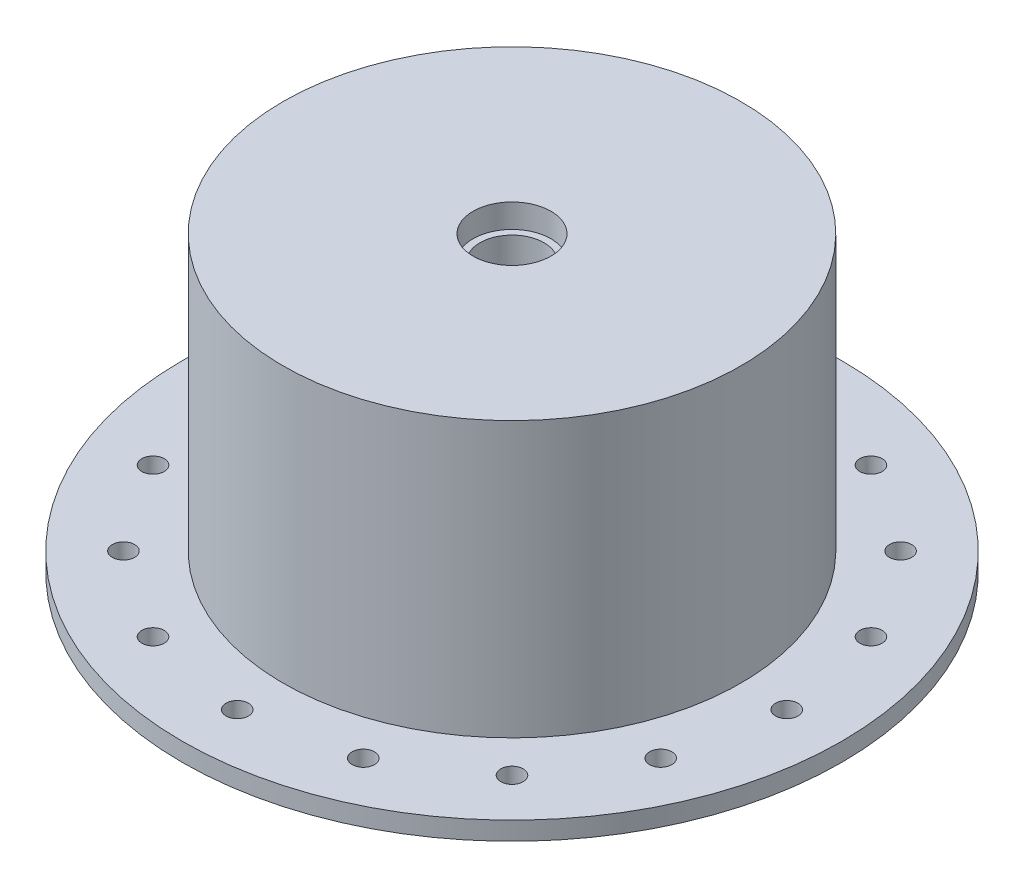
ISO-10303-21;
HEADER;
FILE_DESCRIPTION(('STEP AP214'),'2;1');
FILE_NAME('part.step','',(''),(''),'','','');
FILE_SCHEMA(('AUTOMOTIVE_DESIGN { 1 0 10303 214 1 1 1 1 }'));
ENDSEC;
DATA;
#1=APPLICATION_CONTEXT('core data for automotive mechanical design processes');
#2=APPLICATION_PROTOCOL_DEFINITION('international standard','automotive_design',2000,#1);
#3=PRODUCT_CONTEXT('',#1,'mechanical');
#4=PRODUCT('Part','Part','',(#3));
#5=PRODUCT_RELATED_PRODUCT_CATEGORY('part','',(#4));
#6=PRODUCT_DEFINITION_FORMATION('','',#4);
#7=PRODUCT_DEFINITION_CONTEXT('part definition',#1,'design');
#8=PRODUCT_DEFINITION('design','',#6,#7);
#9=PRODUCT_DEFINITION_SHAPE('','',#8);
#10=(LENGTH_UNIT() NAMED_UNIT(*) SI_UNIT(.MILLI.,.METRE.));
#11=(NAMED_UNIT(*) PLANE_ANGLE_UNIT() SI_UNIT($,.RADIAN.));
#12=(NAMED_UNIT(*) SI_UNIT($,.STERADIAN.) SOLID_ANGLE_UNIT());
#13=UNCERTAINTY_MEASURE_WITH_UNIT(LENGTH_MEASURE(1.E-05),#10,'distance_accuracy_value','');
#14=(GEOMETRIC_REPRESENTATION_CONTEXT(3) GLOBAL_UNCERTAINTY_ASSIGNED_CONTEXT((#13)) GLOBAL_UNIT_ASSIGNED_CONTEXT((#10,
#11,#12)) REPRESENTATION_CONTEXT('',''));
#15=CARTESIAN_POINT('',(0.,0.,0.));
#16=DIRECTION('',(0.,0.,1.));
#17=DIRECTION('',(1.,0.,0.));
#18=AXIS2_PLACEMENT_3D('',#15,#16,#17);
#19=CARTESIAN_POINT('',(0.,80.,0.));
#20=DIRECTION('',(0.,1.,0.));
#21=DIRECTION('',(-1.,0.,0.));
#22=AXIS2_PLACEMENT_3D('',#19,#20,#21);
#23=CYLINDRICAL_SURFACE('',#22,21.25);
#24=CARTESIAN_POINT('',(0.,67.,0.));
#25=DIRECTION('',(0.,1.,0.));
#26=DIRECTION('',(-1.,0.,0.));
#27=AXIS2_PLACEMENT_3D('',#24,#25,#26);
#28=CIRCLE('',#27,21.25);
#29=CARTESIAN_POINT('',(-21.25,67.,0.));
#30=VERTEX_POINT('',#29);
#31=EDGE_CURVE('E66',#30,#30,#28,.T.);
#32=ORIENTED_EDGE('',*,*,#31,.F.);
#33=EDGE_LOOP('',(#32));
#34=FACE_BOUND('',#33,.T.);
#35=CARTESIAN_POINT('',(0.,80.,0.));
#36=DIRECTION('',(0.,1.,0.));
#37=DIRECTION('',(-1.,0.,0.));
#38=AXIS2_PLACEMENT_3D('',#35,#36,#37);
#39=CIRCLE('',#38,21.25);
#40=CARTESIAN_POINT('',(-21.25,80.,0.));
#41=VERTEX_POINT('',#40);
#42=EDGE_CURVE('E10',#41,#41,#39,.T.);
#43=ORIENTED_EDGE('',*,*,#42,.T.);
#44=EDGE_LOOP('',(#43));
#45=FACE_BOUND('',#44,.T.);
#46=ADVANCED_FACE('F32',(#34,#45),#23,.F.);
#47=CARTESIAN_POINT('',(0.,80.,0.));
#48=DIRECTION('',(0.,1.,0.));
#49=DIRECTION('',(-1.,0.,0.));
#50=AXIS2_PLACEMENT_3D('',#47,#48,#49);
#51=PLANE('',#50);
#52=CARTESIAN_POINT('',(0.,80.,0.));
#53=DIRECTION('',(0.,1.,0.));
#54=DIRECTION('',(-1.,0.,0.));
#55=AXIS2_PLACEMENT_3D('',#52,#53,#54);
#56=CIRCLE('',#55,125.);
#57=CARTESIAN_POINT('',(-125.,80.,0.));
#58=VERTEX_POINT('',#57);
#59=EDGE_CURVE('E38',#58,#58,#56,.T.);
#60=ORIENTED_EDGE('',*,*,#59,.T.);
#61=EDGE_LOOP('',(#60));
#62=FACE_BOUND('',#61,.T.);
#63=ORIENTED_EDGE('',*,*,#42,.F.);
#64=EDGE_LOOP('',(#63));
#65=FACE_BOUND('',#64,.T.);
#66=ADVANCED_FACE('F186',(#62,#65),#51,.T.);
#67=CARTESIAN_POINT('',(0.,80.,0.));
#68=DIRECTION('',(0.,1.,0.));
#69=DIRECTION('',(-1.,0.,0.));
#70=AXIS2_PLACEMENT_3D('',#67,#68,#69);
#71=CYLINDRICAL_SURFACE('',#70,125.);
#72=ORIENTED_EDGE('',*,*,#59,.F.);
#73=EDGE_LOOP('',(#72));
#74=FACE_BOUND('',#73,.T.);
#75=CARTESIAN_POINT('',(0.,-70.,0.));
#76=DIRECTION('',(0.,1.,0.));
#77=DIRECTION('',(-1.,0.,0.));
#78=AXIS2_PLACEMENT_3D('',#75,#76,#77);
#79=CIRCLE('',#78,125.);
#80=CARTESIAN_POINT('',(-125.,-70.0000000000001,0.));
#81=VERTEX_POINT('',#80);
#82=EDGE_CURVE('E42',#81,#81,#79,.T.);
#83=ORIENTED_EDGE('',*,*,#82,.T.);
#84=EDGE_LOOP('',(#83));
#85=FACE_BOUND('',#84,.T.);
#86=ADVANCED_FACE('F191',(#74,#85),#71,.T.);
#87=CARTESIAN_POINT('',(0.,-70.,0.));
#88=DIRECTION('',(0.,1.,0.));
#89=DIRECTION('',(-1.,0.,0.));
#90=AXIS2_PLACEMENT_3D('',#87,#88,#89);
#91=PLANE('',#90);
#92=CARTESIAN_POINT('',(-57.402514854763,-70.,-138.581929876691));
#93=DIRECTION('',(0.,1.,0.));
#94=DIRECTION('',(-1.,0.,0.));
#95=AXIS2_PLACEMENT_3D('',#92,#93,#94);
#96=CIRCLE('',#95,6.10000000000463);
#97=CARTESIAN_POINT('',(-63.5025148547677,-70.,-138.581929876691));
#98=VERTEX_POINT('',#97);
#99=EDGE_CURVE('E69',#98,#98,#96,.T.);
#100=ORIENTED_EDGE('',*,*,#99,.F.);
#101=EDGE_LOOP('',(#100));
#102=FACE_BOUND('',#101,.T.);
#103=CARTESIAN_POINT('',(-106.06601717798,-70.,-106.066017177978));
#104=DIRECTION('',(0.,1.,0.));
#105=DIRECTION('',(-1.,0.,0.));
#106=AXIS2_PLACEMENT_3D('',#103,#104,#105);
#107=CIRCLE('',#106,6.10000000000621);
#108=CARTESIAN_POINT('',(-112.166017177986,-70.,-106.066017177978));
#109=VERTEX_POINT('',#108);
#110=EDGE_CURVE('E72',#109,#109,#107,.T.);
#111=ORIENTED_EDGE('',*,*,#110,.F.);
#112=EDGE_LOOP('',(#111));
#113=FACE_BOUND('',#112,.T.);
#114=CARTESIAN_POINT('',(-138.581929876689,-70.,-57.4025148547576));
#115=DIRECTION('',(0.,1.,0.));
#116=DIRECTION('',(-1.,0.,0.));
#117=AXIS2_PLACEMENT_3D('',#114,#115,#116);
#118=CIRCLE('',#117,6.1000000000083);
#119=CARTESIAN_POINT('',(-144.681929876697,-70.,-57.4025148547576));
#120=VERTEX_POINT('',#119);
#121=EDGE_CURVE('E75',#120,#120,#118,.T.);
#122=ORIENTED_EDGE('',*,*,#121,.F.);
#123=EDGE_LOOP('',(#122));
#124=FACE_BOUND('',#123,.T.);
#125=CARTESIAN_POINT('',(-149.999999999994,-70.,6.3856997708473E-12));
#126=DIRECTION('',(0.,1.,0.));
#127=DIRECTION('',(-1.,0.,0.));
#128=AXIS2_PLACEMENT_3D('',#125,#126,#127);
#129=CIRCLE('',#128,6.10000000001255);
#130=CARTESIAN_POINT('',(-156.100000000006,-70.,6.3856997708473E-12));
#131=VERTEX_POINT('',#130);
#132=EDGE_CURVE('E78',#131,#131,#129,.T.);
#133=ORIENTED_EDGE('',*,*,#132,.F.);
#134=EDGE_LOOP('',(#133));
#135=FACE_BOUND('',#134,.T.);
#136=CARTESIAN_POINT('',(-138.581929876684,-70.,57.4025148547694));
#137=DIRECTION('',(0.,1.,0.));
#138=DIRECTION('',(-1.,0.,0.));
#139=AXIS2_PLACEMENT_3D('',#136,#137,#138);
#140=CIRCLE('',#139,6.10000000001461);
#141=CARTESIAN_POINT('',(-144.681929876699,-70.,57.4025148547694));
#142=VERTEX_POINT('',#141);
#143=EDGE_CURVE('E81',#142,#142,#140,.T.);
#144=ORIENTED_EDGE('',*,*,#143,.F.);
#145=EDGE_LOOP('',(#144));
#146=FACE_BOUND('',#145,.T.);
#147=CARTESIAN_POINT('',(-106.066017177971,-70.,106.066017177987));
#148=DIRECTION('',(0.,1.,0.));
#149=DIRECTION('',(-1.,0.,0.));
#150=AXIS2_PLACEMENT_3D('',#147,#148,#149);
#151=CIRCLE('',#150,6.10000000001588);
#152=CARTESIAN_POINT('',(-112.166017177987,-70.,106.066017177987));
#153=VERTEX_POINT('',#152);
#154=EDGE_CURVE('E84',#153,#153,#151,.T.);
#155=ORIENTED_EDGE('',*,*,#154,.F.);
#156=EDGE_LOOP('',(#155));
#157=FACE_BOUND('',#156,.T.);
#158=CARTESIAN_POINT('',(-57.4025148547512,-70.,138.581929876695));
#159=DIRECTION('',(0.,1.,0.));
#160=DIRECTION('',(-1.,0.,0.));
#161=AXIS2_PLACEMENT_3D('',#158,#159,#160);
#162=CIRCLE('',#161,6.10000000001635);
#163=CARTESIAN_POINT('',(-63.5025148547675,-70.,138.581929876695));
#164=VERTEX_POINT('',#163);
#165=EDGE_CURVE('E87',#164,#164,#162,.T.);
#166=ORIENTED_EDGE('',*,*,#165,.F.);
#167=EDGE_LOOP('',(#166));
#168=FACE_BOUND('',#167,.T.);
#169=CARTESIAN_POINT('',(1.27560914567053E-11,-70.,150.));
#170=DIRECTION('',(0.,1.,0.));
#171=DIRECTION('',(-1.,0.,0.));
#172=AXIS2_PLACEMENT_3D('',#169,#170,#171);
#173=CIRCLE('',#172,6.10000000001599);
#174=CARTESIAN_POINT('',(-6.10000000000323,-70.,150.));
#175=VERTEX_POINT('',#174);
#176=EDGE_CURVE('E90',#175,#175,#173,.T.);
#177=ORIENTED_EDGE('',*,*,#176,.F.);
#178=EDGE_LOOP('',(#177));
#179=FACE_BOUND('',#178,.T.);
#180=CARTESIAN_POINT('',(57.4025148547757,-70.,138.581929876691));
#181=DIRECTION('',(0.,1.,0.));
#182=DIRECTION('',(-1.,0.,0.));
#183=AXIS2_PLACEMENT_3D('',#180,#181,#182);
#184=CIRCLE('',#183,6.10000000001459);
#185=CARTESIAN_POINT('',(51.3025148547611,-70.,138.581929876691));
#186=VERTEX_POINT('',#185);
#187=EDGE_CURVE('E93',#186,#186,#184,.T.);
#188=ORIENTED_EDGE('',*,*,#187,.F.);
#189=EDGE_LOOP('',(#188));
#190=FACE_BOUND('',#189,.T.);
#191=CARTESIAN_POINT('',(106.066017177993,-70.,106.066017177978));
#192=DIRECTION('',(0.,1.,0.));
#193=DIRECTION('',(-1.,0.,0.));
#194=AXIS2_PLACEMENT_3D('',#191,#192,#193);
#195=CIRCLE('',#194,6.10000000001236);
#196=CARTESIAN_POINT('',(99.9660171779806,-70.,106.066017177978));
#197=VERTEX_POINT('',#196);
#198=EDGE_CURVE('E96',#197,#197,#195,.T.);
#199=ORIENTED_EDGE('',*,*,#198,.F.);
#200=EDGE_LOOP('',(#199));
#201=FACE_BOUND('',#200,.T.);
#202=CARTESIAN_POINT('',(138.581929876702,-70.,57.4025148547576));
#203=DIRECTION('',(0.,1.,0.));
#204=DIRECTION('',(-1.,0.,0.));
#205=AXIS2_PLACEMENT_3D('',#202,#203,#204);
#206=CIRCLE('',#205,6.10000000000972);
#207=CARTESIAN_POINT('',(132.481929876692,-70.,57.4025148547576));
#208=VERTEX_POINT('',#207);
#209=EDGE_CURVE('E99',#208,#208,#206,.T.);
#210=ORIENTED_EDGE('',*,*,#209,.F.);
#211=EDGE_LOOP('',(#210));
#212=FACE_BOUND('',#211,.T.);
#213=CARTESIAN_POINT('',(150.000000000006,-70.,-6.36733006886009E-12));
#214=DIRECTION('',(0.,1.,0.));
#215=DIRECTION('',(-1.,0.,0.));
#216=AXIS2_PLACEMENT_3D('',#213,#214,#215);
#217=CIRCLE('',#216,6.10000000000717);
#218=CARTESIAN_POINT('',(143.899999999999,-70.,-6.36733006886009E-12));
#219=VERTEX_POINT('',#218);
#220=EDGE_CURVE('E102',#219,#219,#217,.T.);
#221=ORIENTED_EDGE('',*,*,#220,.F.);
#222=EDGE_LOOP('',(#221));
#223=FACE_BOUND('',#222,.T.);
#224=CARTESIAN_POINT('',(138.581929876697,-70.,-57.4025148547694));
#225=DIRECTION('',(0.,1.,0.));
#226=DIRECTION('',(-1.,0.,0.));
#227=AXIS2_PLACEMENT_3D('',#224,#225,#226);
#228=CIRCLE('',#227,6.10000000000469);
#229=CARTESIAN_POINT('',(132.481929876692,-70.,-57.4025148547694));
#230=VERTEX_POINT('',#229);
#231=EDGE_CURVE('E105',#230,#230,#228,.T.);
#232=ORIENTED_EDGE('',*,*,#231,.F.);
#233=EDGE_LOOP('',(#232));
#234=FACE_BOUND('',#233,.T.);
#235=CARTESIAN_POINT('',(106.066017177984,-70.,-106.066017177987));
#236=DIRECTION('',(0.,1.,0.));
#237=DIRECTION('',(-1.,0.,0.));
#238=AXIS2_PLACEMENT_3D('',#235,#236,#237);
#239=CIRCLE('',#238,6.10000000000195);
#240=CARTESIAN_POINT('',(99.9660171779821,-70.,-106.066017177987));
#241=VERTEX_POINT('',#240);
#242=EDGE_CURVE('E108',#241,#241,#239,.T.);
#243=ORIENTED_EDGE('',*,*,#242,.F.);
#244=EDGE_LOOP('',(#243));
#245=FACE_BOUND('',#244,.T.);
#246=CARTESIAN_POINT('',(57.4025148547653,-70.,-138.581929876692));
#247=DIRECTION('',(0.,1.,0.));
#248=DIRECTION('',(-1.,0.,0.));
#249=AXIS2_PLACEMENT_3D('',#246,#247,#248);
#250=CIRCLE('',#249,6.09999999999999);
#251=CARTESIAN_POINT('',(51.3025148547653,-70.,-138.581929876692));
#252=VERTEX_POINT('',#251);
#253=EDGE_CURVE('E111',#252,#252,#250,.T.);
#254=ORIENTED_EDGE('',*,*,#253,.F.);
#255=EDGE_LOOP('',(#254));
#256=FACE_BOUND('',#255,.T.);
#257=CARTESIAN_POINT('',(0.,-70.,-150.));
#258=DIRECTION('',(0.,1.,0.));
#259=DIRECTION('',(-1.,0.,0.));
#260=AXIS2_PLACEMENT_3D('',#257,#258,#259);
#261=CIRCLE('',#260,6.09999999999999);
#262=CARTESIAN_POINT('',(-6.09999999999997,-70.,-150.));
#263=VERTEX_POINT('',#262);
#264=EDGE_CURVE('E114',#263,#263,#261,.T.);
#265=ORIENTED_EDGE('',*,*,#264,.F.);
#266=EDGE_LOOP('',(#265));
#267=FACE_BOUND('',#266,.T.);
#268=CARTESIAN_POINT('',(0.,-70.,0.));
#269=DIRECTION('',(0.,1.,0.));
#270=DIRECTION('',(-1.,0.,0.));
#271=AXIS2_PLACEMENT_3D('',#268,#269,#270);
#272=CIRCLE('',#271,180.);
#273=CARTESIAN_POINT('',(-180.,-70.,0.));
#274=VERTEX_POINT('',#273);
#275=EDGE_CURVE('E46',#274,#274,#272,.T.);
#276=ORIENTED_EDGE('',*,*,#275,.T.);
#277=EDGE_LOOP('',(#276));
#278=FACE_BOUND('',#277,.T.);
#279=ORIENTED_EDGE('',*,*,#82,.F.);
#280=EDGE_LOOP('',(#279));
#281=FACE_BOUND('',#280,.T.);
#282=ADVANCED_FACE('F220',(#102,#113,#124,#135,#146,#157,#168,#179,#190,#201,#212,#223,#234,
#245,#256,#267,#278,#281),#91,.T.);
#283=CARTESIAN_POINT('',(0.,80.,0.));
#284=DIRECTION('',(0.,1.,0.));
#285=DIRECTION('',(-1.,0.,0.));
#286=AXIS2_PLACEMENT_3D('',#283,#284,#285);
#287=CYLINDRICAL_SURFACE('',#286,180.);
#288=CARTESIAN_POINT('',(0.,-80.,0.));
#289=DIRECTION('',(0.,1.,0.));
#290=DIRECTION('',(-1.,0.,0.));
#291=AXIS2_PLACEMENT_3D('',#288,#289,#290);
#292=CIRCLE('',#291,180.);
#293=CARTESIAN_POINT('',(-180.,-80.,0.));
#294=VERTEX_POINT('',#293);
#295=EDGE_CURVE('E51',#294,#294,#292,.T.);
#296=ORIENTED_EDGE('',*,*,#295,.T.);
#297=EDGE_LOOP('',(#296));
#298=FACE_BOUND('',#297,.T.);
#299=ORIENTED_EDGE('',*,*,#275,.F.);
#300=EDGE_LOOP('',(#299));
#301=FACE_BOUND('',#300,.T.);
#302=ADVANCED_FACE('F216',(#298,#301),#287,.T.);
#303=CARTESIAN_POINT('',(0.,-80.,0.));
#304=DIRECTION('',(0.,-1.,0.));
#305=DIRECTION('',(1.,0.,0.));
#306=AXIS2_PLACEMENT_3D('',#303,#304,#305);
#307=PLANE('',#306);
#308=CARTESIAN_POINT('',(-57.402514854763,-80.,-138.581929876691));
#309=DIRECTION('',(0.,1.,0.));
#310=DIRECTION('',(0.,0.,1.));
#311=AXIS2_PLACEMENT_3D('',#308,#309,#310);
#312=CIRCLE('',#311,6.10000000000463);
#313=CARTESIAN_POINT('',(-57.402514854763,-80.,-132.481929876686));
#314=VERTEX_POINT('',#313);
#315=EDGE_CURVE('E121',#314,#314,#312,.T.);
#316=ORIENTED_EDGE('',*,*,#315,.T.);
#317=EDGE_LOOP('',(#316));
#318=FACE_BOUND('',#317,.T.);
#319=CARTESIAN_POINT('',(-106.06601717798,-80.,-106.066017177978));
#320=DIRECTION('',(0.,1.,0.));
#321=DIRECTION('',(0.,0.,1.));
#322=AXIS2_PLACEMENT_3D('',#319,#320,#321);
#323=CIRCLE('',#322,6.10000000000621);
#324=CARTESIAN_POINT('',(-106.06601717798,-80.,-99.9660171779714));
#325=VERTEX_POINT('',#324);
#326=EDGE_CURVE('E124',#325,#325,#323,.T.);
#327=ORIENTED_EDGE('',*,*,#326,.T.);
#328=EDGE_LOOP('',(#327));
#329=FACE_BOUND('',#328,.T.);
#330=CARTESIAN_POINT('',(-138.581929876689,-80.,-57.4025148547576));
#331=DIRECTION('',(0.,1.,0.));
#332=DIRECTION('',(0.,0.,1.));
#333=AXIS2_PLACEMENT_3D('',#330,#331,#332);
#334=CIRCLE('',#333,6.1000000000083);
#335=CARTESIAN_POINT('',(-138.581929876689,-80.,-51.3025148547493));
#336=VERTEX_POINT('',#335);
#337=EDGE_CURVE('E127',#336,#336,#334,.T.);
#338=ORIENTED_EDGE('',*,*,#337,.T.);
#339=EDGE_LOOP('',(#338));
#340=FACE_BOUND('',#339,.T.);
#341=CARTESIAN_POINT('',(-149.999999999994,-80.,6.3856997708473E-12));
#342=DIRECTION('',(0.,1.,0.));
#343=DIRECTION('',(0.,0.,1.));
#344=AXIS2_PLACEMENT_3D('',#341,#342,#343);
#345=CIRCLE('',#344,6.10000000001255);
#346=CARTESIAN_POINT('',(-149.999999999994,-80.,6.10000000001893));
#347=VERTEX_POINT('',#346);
#348=EDGE_CURVE('E130',#347,#347,#345,.T.);
#349=ORIENTED_EDGE('',*,*,#348,.T.);
#350=EDGE_LOOP('',(#349));
#351=FACE_BOUND('',#350,.T.);
#352=CARTESIAN_POINT('',(-138.581929876684,-80.,57.4025148547694));
#353=DIRECTION('',(0.,1.,0.));
#354=DIRECTION('',(0.,0.,1.));
#355=AXIS2_PLACEMENT_3D('',#352,#353,#354);
#356=CIRCLE('',#355,6.10000000001461);
#357=CARTESIAN_POINT('',(-138.581929876684,-80.,63.502514854784));
#358=VERTEX_POINT('',#357);
#359=EDGE_CURVE('E133',#358,#358,#356,.T.);
#360=ORIENTED_EDGE('',*,*,#359,.T.);
#361=EDGE_LOOP('',(#360));
#362=FACE_BOUND('',#361,.T.);
#363=CARTESIAN_POINT('',(-106.066017177971,-80.,106.066017177987));
#364=DIRECTION('',(0.,1.,0.));
#365=DIRECTION('',(0.,0.,1.));
#366=AXIS2_PLACEMENT_3D('',#363,#364,#365);
#367=CIRCLE('',#366,6.10000000001588);
#368=CARTESIAN_POINT('',(-106.066017177971,-80.,112.166017178003));
#369=VERTEX_POINT('',#368);
#370=EDGE_CURVE('E136',#369,#369,#367,.T.);
#371=ORIENTED_EDGE('',*,*,#370,.T.);
#372=EDGE_LOOP('',(#371));
#373=FACE_BOUND('',#372,.T.);
#374=CARTESIAN_POINT('',(-57.4025148547512,-80.,138.581929876695));
#375=DIRECTION('',(0.,1.,0.));
#376=DIRECTION('',(0.,0.,1.));
#377=AXIS2_PLACEMENT_3D('',#374,#375,#376);
#378=CIRCLE('',#377,6.10000000001635);
#379=CARTESIAN_POINT('',(-57.4025148547512,-80.,144.681929876712));
#380=VERTEX_POINT('',#379);
#381=EDGE_CURVE('E139',#380,#380,#378,.T.);
#382=ORIENTED_EDGE('',*,*,#381,.T.);
#383=EDGE_LOOP('',(#382));
#384=FACE_BOUND('',#383,.T.);
#385=CARTESIAN_POINT('',(1.27560914567053E-11,-80.,150.));
#386=DIRECTION('',(0.,1.,0.));
#387=DIRECTION('',(0.,0.,1.));
#388=AXIS2_PLACEMENT_3D('',#385,#386,#387);
#389=CIRCLE('',#388,6.10000000001599);
#390=CARTESIAN_POINT('',(1.27560914567053E-11,-80.,156.100000000016));
#391=VERTEX_POINT('',#390);
#392=EDGE_CURVE('E142',#391,#391,#389,.T.);
#393=ORIENTED_EDGE('',*,*,#392,.T.);
#394=EDGE_LOOP('',(#393));
#395=FACE_BOUND('',#394,.T.);
#396=CARTESIAN_POINT('',(57.4025148547757,-80.,138.581929876691));
#397=DIRECTION('',(0.,1.,0.));
#398=DIRECTION('',(0.,0.,1.));
#399=AXIS2_PLACEMENT_3D('',#396,#397,#398);
#400=CIRCLE('',#399,6.10000000001459);
#401=CARTESIAN_POINT('',(57.4025148547757,-80.,144.681929876705));
#402=VERTEX_POINT('',#401);
#403=EDGE_CURVE('E145',#402,#402,#400,.T.);
#404=ORIENTED_EDGE('',*,*,#403,.T.);
#405=EDGE_LOOP('',(#404));
#406=FACE_BOUND('',#405,.T.);
#407=CARTESIAN_POINT('',(106.066017177993,-80.,106.066017177978));
#408=DIRECTION('',(0.,1.,0.));
#409=DIRECTION('',(0.,0.,1.));
#410=AXIS2_PLACEMENT_3D('',#407,#408,#409);
#411=CIRCLE('',#410,6.10000000001236);
#412=CARTESIAN_POINT('',(106.066017177993,-80.,112.16601717799));
#413=VERTEX_POINT('',#412);
#414=EDGE_CURVE('E148',#413,#413,#411,.T.);
#415=ORIENTED_EDGE('',*,*,#414,.T.);
#416=EDGE_LOOP('',(#415));
#417=FACE_BOUND('',#416,.T.);
#418=CARTESIAN_POINT('',(138.581929876702,-80.,57.4025148547576));
#419=DIRECTION('',(0.,1.,0.));
#420=DIRECTION('',(0.,0.,1.));
#421=AXIS2_PLACEMENT_3D('',#418,#419,#420);
#422=CIRCLE('',#421,6.10000000000972);
#423=CARTESIAN_POINT('',(138.581929876702,-80.,63.5025148547673));
#424=VERTEX_POINT('',#423);
#425=EDGE_CURVE('E151',#424,#424,#422,.T.);
#426=ORIENTED_EDGE('',*,*,#425,.T.);
#427=EDGE_LOOP('',(#426));
#428=FACE_BOUND('',#427,.T.);
#429=CARTESIAN_POINT('',(150.000000000006,-80.,-6.36733006886009E-12));
#430=DIRECTION('',(0.,1.,0.));
#431=DIRECTION('',(0.,0.,1.));
#432=AXIS2_PLACEMENT_3D('',#429,#430,#431);
#433=CIRCLE('',#432,6.10000000000717);
#434=CARTESIAN_POINT('',(150.000000000006,-80.,6.1000000000008));
#435=VERTEX_POINT('',#434);
#436=EDGE_CURVE('E154',#435,#435,#433,.T.);
#437=ORIENTED_EDGE('',*,*,#436,.T.);
#438=EDGE_LOOP('',(#437));
#439=FACE_BOUND('',#438,.T.);
#440=CARTESIAN_POINT('',(138.581929876697,-80.,-57.4025148547694));
#441=DIRECTION('',(0.,1.,0.));
#442=DIRECTION('',(0.,0.,1.));
#443=AXIS2_PLACEMENT_3D('',#440,#441,#442);
#444=CIRCLE('',#443,6.10000000000469);
#445=CARTESIAN_POINT('',(138.581929876697,-80.,-51.3025148547647));
#446=VERTEX_POINT('',#445);
#447=EDGE_CURVE('E157',#446,#446,#444,.T.);
#448=ORIENTED_EDGE('',*,*,#447,.T.);
#449=EDGE_LOOP('',(#448));
#450=FACE_BOUND('',#449,.T.);
#451=CARTESIAN_POINT('',(106.066017177984,-80.,-106.066017177987));
#452=DIRECTION('',(0.,1.,0.));
#453=DIRECTION('',(0.,0.,1.));
#454=AXIS2_PLACEMENT_3D('',#451,#452,#453);
#455=CIRCLE('',#454,6.10000000000195);
#456=CARTESIAN_POINT('',(106.066017177984,-80.,-99.9660171779847));
#457=VERTEX_POINT('',#456);
#458=EDGE_CURVE('E160',#457,#457,#455,.T.);
#459=ORIENTED_EDGE('',*,*,#458,.T.);
#460=EDGE_LOOP('',(#459));
#461=FACE_BOUND('',#460,.T.);
#462=CARTESIAN_POINT('',(57.4025148547653,-80.,-138.581929876692));
#463=DIRECTION('',(0.,1.,0.));
#464=DIRECTION('',(0.,0.,1.));
#465=AXIS2_PLACEMENT_3D('',#462,#463,#464);
#466=CIRCLE('',#465,6.09999999999999);
#467=CARTESIAN_POINT('',(57.4025148547653,-80.,-132.481929876692));
#468=VERTEX_POINT('',#467);
#469=EDGE_CURVE('E120',#468,#468,#466,.T.);
#470=ORIENTED_EDGE('',*,*,#469,.T.);
#471=EDGE_LOOP('',(#470));
#472=FACE_BOUND('',#471,.T.);
#473=CARTESIAN_POINT('',(0.,-80.,-150.));
#474=DIRECTION('',(0.,1.,0.));
#475=DIRECTION('',(0.,0.,1.));
#476=AXIS2_PLACEMENT_3D('',#473,#474,#475);
#477=CIRCLE('',#476,6.09999999999999);
#478=CARTESIAN_POINT('',(0.,-80.,-143.9));
#479=VERTEX_POINT('',#478);
#480=EDGE_CURVE('E117',#479,#479,#477,.T.);
#481=ORIENTED_EDGE('',*,*,#480,.T.);
#482=EDGE_LOOP('',(#481));
#483=FACE_BOUND('',#482,.T.);
#484=CARTESIAN_POINT('',(0.,-80.,0.));
#485=DIRECTION('',(0.,1.,0.));
#486=DIRECTION('',(-1.,0.,0.));
#487=AXIS2_PLACEMENT_3D('',#484,#485,#486);
#488=CIRCLE('',#487,21.25);
#489=CARTESIAN_POINT('',(-21.25,-80.,0.));
#490=VERTEX_POINT('',#489);
#491=EDGE_CURVE('E54',#490,#490,#488,.T.);
#492=ORIENTED_EDGE('',*,*,#491,.T.);
#493=EDGE_LOOP('',(#492));
#494=FACE_BOUND('',#493,.T.);
#495=ORIENTED_EDGE('',*,*,#295,.F.);
#496=EDGE_LOOP('',(#495));
#497=FACE_BOUND('',#496,.T.);
#498=ADVANCED_FACE('F166',(#318,#329,#340,#351,#362,#373,#384,#395,#406,#417,#428,#439,#450,
#461,#472,#483,#494,#497),#307,.T.);
#499=CARTESIAN_POINT('',(0.,80.,0.));
#500=DIRECTION('',(0.,1.,0.));
#501=DIRECTION('',(-1.,0.,0.));
#502=AXIS2_PLACEMENT_3D('',#499,#500,#501);
#503=CYLINDRICAL_SURFACE('',#502,21.25);
#504=CARTESIAN_POINT('',(0.,-67.,0.));
#505=DIRECTION('',(0.,1.,0.));
#506=DIRECTION('',(-1.,0.,0.));
#507=AXIS2_PLACEMENT_3D('',#504,#505,#506);
#508=CIRCLE('',#507,21.25);
#509=CARTESIAN_POINT('',(-21.25,-67.,0.));
#510=VERTEX_POINT('',#509);
#511=EDGE_CURVE('E57',#510,#510,#508,.T.);
#512=ORIENTED_EDGE('',*,*,#511,.T.);
#513=EDGE_LOOP('',(#512));
#514=FACE_BOUND('',#513,.T.);
#515=ORIENTED_EDGE('',*,*,#491,.F.);
#516=EDGE_LOOP('',(#515));
#517=FACE_BOUND('',#516,.T.);
#518=ADVANCED_FACE('F209',(#514,#517),#503,.F.);
#519=CARTESIAN_POINT('',(-2.47949808832952E-13,-67.,0.));
#520=DIRECTION('',(0.,-1.,0.));
#521=DIRECTION('',(1.,0.,0.));
#522=AXIS2_PLACEMENT_3D('',#519,#520,#521);
#523=PLANE('',#522);
#524=CARTESIAN_POINT('',(0.,-67.,0.));
#525=DIRECTION('',(0.,1.,0.));
#526=DIRECTION('',(-1.,0.,0.));
#527=AXIS2_PLACEMENT_3D('',#524,#525,#526);
#528=CIRCLE('',#527,17.5);
#529=CARTESIAN_POINT('',(-17.5,-67.,0.));
#530=VERTEX_POINT('',#529);
#531=EDGE_CURVE('E60',#530,#530,#528,.T.);
#532=ORIENTED_EDGE('',*,*,#531,.T.);
#533=EDGE_LOOP('',(#532));
#534=FACE_BOUND('',#533,.T.);
#535=ORIENTED_EDGE('',*,*,#511,.F.);
#536=EDGE_LOOP('',(#535));
#537=FACE_BOUND('',#536,.T.);
#538=ADVANCED_FACE('F201',(#534,#537),#523,.T.);
#539=CARTESIAN_POINT('',(0.,80.,0.));
#540=DIRECTION('',(0.,1.,0.));
#541=DIRECTION('',(-1.,0.,0.));
#542=AXIS2_PLACEMENT_3D('',#539,#540,#541);
#543=CYLINDRICAL_SURFACE('',#542,17.5);
#544=CARTESIAN_POINT('',(0.,67.,0.));
#545=DIRECTION('',(0.,1.,0.));
#546=DIRECTION('',(-1.,0.,0.));
#547=AXIS2_PLACEMENT_3D('',#544,#545,#546);
#548=CIRCLE('',#547,17.4999999999999);
#549=CARTESIAN_POINT('',(-17.5,67.,0.));
#550=VERTEX_POINT('',#549);
#551=EDGE_CURVE('E63',#550,#550,#548,.T.);
#552=ORIENTED_EDGE('',*,*,#551,.T.);
#553=EDGE_LOOP('',(#552));
#554=FACE_BOUND('',#553,.T.);
#555=ORIENTED_EDGE('',*,*,#531,.F.);
#556=EDGE_LOOP('',(#555));
#557=FACE_BOUND('',#556,.T.);
#558=ADVANCED_FACE('F195',(#554,#557),#543,.F.);
#559=CARTESIAN_POINT('',(-2.47949808832951E-13,67.,0.));
#560=DIRECTION('',(0.,-1.,0.));
#561=DIRECTION('',(1.,0.,0.));
#562=AXIS2_PLACEMENT_3D('',#559,#560,#561);
#563=PLANE('',#562);
#564=ORIENTED_EDGE('',*,*,#551,.F.);
#565=EDGE_LOOP('',(#564));
#566=FACE_BOUND('',#565,.T.);
#567=ORIENTED_EDGE('',*,*,#31,.T.);
#568=EDGE_LOOP('',(#567));
#569=FACE_BOUND('',#568,.T.);
#570=ADVANCED_FACE('F182',(#566,#569),#563,.F.);
#571=CARTESIAN_POINT('',(0.,-80.,-150.));
#572=DIRECTION('',(0.,1.,0.));
#573=DIRECTION('',(0.,0.,1.));
#574=AXIS2_PLACEMENT_3D('',#571,#572,#573);
#575=CYLINDRICAL_SURFACE('',#574,6.09999999999999);
#576=ORIENTED_EDGE('',*,*,#264,.T.);
#577=EDGE_LOOP('',(#576));
#578=FACE_BOUND('',#577,.T.);
#579=ORIENTED_EDGE('',*,*,#480,.F.);
#580=EDGE_LOOP('',(#579));
#581=FACE_BOUND('',#580,.T.);
#582=ADVANCED_FACE('F172',(#578,#581),#575,.F.);
#583=CARTESIAN_POINT('',(57.4025148547653,-80.,-138.581929876692));
#584=DIRECTION('',(0.,1.,0.));
#585=DIRECTION('',(0.,0.,1.));
#586=AXIS2_PLACEMENT_3D('',#583,#584,#585);
#587=CYLINDRICAL_SURFACE('',#586,6.09999999999999);
#588=ORIENTED_EDGE('',*,*,#253,.T.);
#589=EDGE_LOOP('',(#588));
#590=FACE_BOUND('',#589,.T.);
#591=ORIENTED_EDGE('',*,*,#469,.F.);
#592=EDGE_LOOP('',(#591));
#593=FACE_BOUND('',#592,.T.);
#594=ADVANCED_FACE('F169',(#590,#593),#587,.F.);
#595=CARTESIAN_POINT('',(106.066017177984,-80.,-106.066017177987));
#596=DIRECTION('',(0.,1.,0.));
#597=DIRECTION('',(0.,0.,1.));
#598=AXIS2_PLACEMENT_3D('',#595,#596,#597);
#599=CYLINDRICAL_SURFACE('',#598,6.10000000000195);
#600=ORIENTED_EDGE('',*,*,#242,.T.);
#601=EDGE_LOOP('',(#600));
#602=FACE_BOUND('',#601,.T.);
#603=ORIENTED_EDGE('',*,*,#458,.F.);
#604=EDGE_LOOP('',(#603));
#605=FACE_BOUND('',#604,.T.);
#606=ADVANCED_FACE('F171',(#602,#605),#599,.F.);
#607=CARTESIAN_POINT('',(138.581929876697,-80.,-57.4025148547694));
#608=DIRECTION('',(0.,1.,0.));
#609=DIRECTION('',(0.,0.,1.));
#610=AXIS2_PLACEMENT_3D('',#607,#608,#609);
#611=CYLINDRICAL_SURFACE('',#610,6.10000000000469);
#612=ORIENTED_EDGE('',*,*,#231,.T.);
#613=EDGE_LOOP('',(#612));
#614=FACE_BOUND('',#613,.T.);
#615=ORIENTED_EDGE('',*,*,#447,.F.);
#616=EDGE_LOOP('',(#615));
#617=FACE_BOUND('',#616,.T.);
#618=ADVANCED_FACE('F179',(#614,#617),#611,.F.);
#619=CARTESIAN_POINT('',(150.000000000006,-80.,-6.36733006886009E-12));
#620=DIRECTION('',(0.,1.,0.));
#621=DIRECTION('',(0.,0.,1.));
#622=AXIS2_PLACEMENT_3D('',#619,#620,#621);
#623=CYLINDRICAL_SURFACE('',#622,6.10000000000717);
#624=ORIENTED_EDGE('',*,*,#220,.T.);
#625=EDGE_LOOP('',(#624));
#626=FACE_BOUND('',#625,.T.);
#627=ORIENTED_EDGE('',*,*,#436,.F.);
#628=EDGE_LOOP('',(#627));
#629=FACE_BOUND('',#628,.T.);
#630=ADVANCED_FACE('F286',(#626,#629),#623,.F.);
#631=CARTESIAN_POINT('',(138.581929876702,-80.,57.4025148547576));
#632=DIRECTION('',(0.,1.,0.));
#633=DIRECTION('',(0.,0.,1.));
#634=AXIS2_PLACEMENT_3D('',#631,#632,#633);
#635=CYLINDRICAL_SURFACE('',#634,6.10000000000972);
#636=ORIENTED_EDGE('',*,*,#209,.T.);
#637=EDGE_LOOP('',(#636));
#638=FACE_BOUND('',#637,.T.);
#639=ORIENTED_EDGE('',*,*,#425,.F.);
#640=EDGE_LOOP('',(#639));
#641=FACE_BOUND('',#640,.T.);
#642=ADVANCED_FACE('F295',(#638,#641),#635,.F.);
#643=CARTESIAN_POINT('',(106.066017177993,-80.,106.066017177978));
#644=DIRECTION('',(0.,1.,0.));
#645=DIRECTION('',(0.,0.,1.));
#646=AXIS2_PLACEMENT_3D('',#643,#644,#645);
#647=CYLINDRICAL_SURFACE('',#646,6.10000000001236);
#648=ORIENTED_EDGE('',*,*,#198,.T.);
#649=EDGE_LOOP('',(#648));
#650=FACE_BOUND('',#649,.T.);
#651=ORIENTED_EDGE('',*,*,#414,.F.);
#652=EDGE_LOOP('',(#651));
#653=FACE_BOUND('',#652,.T.);
#654=ADVANCED_FACE('F304',(#650,#653),#647,.F.);
#655=CARTESIAN_POINT('',(57.4025148547757,-80.,138.581929876691));
#656=DIRECTION('',(0.,1.,0.));
#657=DIRECTION('',(0.,0.,1.));
#658=AXIS2_PLACEMENT_3D('',#655,#656,#657);
#659=CYLINDRICAL_SURFACE('',#658,6.10000000001459);
#660=ORIENTED_EDGE('',*,*,#187,.T.);
#661=EDGE_LOOP('',(#660));
#662=FACE_BOUND('',#661,.T.);
#663=ORIENTED_EDGE('',*,*,#403,.F.);
#664=EDGE_LOOP('',(#663));
#665=FACE_BOUND('',#664,.T.);
#666=ADVANCED_FACE('F313',(#662,#665),#659,.F.);
#667=CARTESIAN_POINT('',(1.27560914567053E-11,-80.,150.));
#668=DIRECTION('',(0.,1.,0.));
#669=DIRECTION('',(0.,0.,1.));
#670=AXIS2_PLACEMENT_3D('',#667,#668,#669);
#671=CYLINDRICAL_SURFACE('',#670,6.10000000001599);
#672=ORIENTED_EDGE('',*,*,#176,.T.);
#673=EDGE_LOOP('',(#672));
#674=FACE_BOUND('',#673,.T.);
#675=ORIENTED_EDGE('',*,*,#392,.F.);
#676=EDGE_LOOP('',(#675));
#677=FACE_BOUND('',#676,.T.);
#678=ADVANCED_FACE('F322',(#674,#677),#671,.F.);
#679=CARTESIAN_POINT('',(-57.4025148547512,-80.,138.581929876695));
#680=DIRECTION('',(0.,1.,0.));
#681=DIRECTION('',(0.,0.,1.));
#682=AXIS2_PLACEMENT_3D('',#679,#680,#681);
#683=CYLINDRICAL_SURFACE('',#682,6.10000000001635);
#684=ORIENTED_EDGE('',*,*,#165,.T.);
#685=EDGE_LOOP('',(#684));
#686=FACE_BOUND('',#685,.T.);
#687=ORIENTED_EDGE('',*,*,#381,.F.);
#688=EDGE_LOOP('',(#687));
#689=FACE_BOUND('',#688,.T.);
#690=ADVANCED_FACE('F331',(#686,#689),#683,.F.);
#691=CARTESIAN_POINT('',(-106.066017177971,-80.,106.066017177987));
#692=DIRECTION('',(0.,1.,0.));
#693=DIRECTION('',(0.,0.,1.));
#694=AXIS2_PLACEMENT_3D('',#691,#692,#693);
#695=CYLINDRICAL_SURFACE('',#694,6.10000000001588);
#696=ORIENTED_EDGE('',*,*,#154,.T.);
#697=EDGE_LOOP('',(#696));
#698=FACE_BOUND('',#697,.T.);
#699=ORIENTED_EDGE('',*,*,#370,.F.);
#700=EDGE_LOOP('',(#699));
#701=FACE_BOUND('',#700,.T.);
#702=ADVANCED_FACE('F340',(#698,#701),#695,.F.);
#703=CARTESIAN_POINT('',(-138.581929876684,-80.,57.4025148547694));
#704=DIRECTION('',(0.,1.,0.));
#705=DIRECTION('',(0.,0.,1.));
#706=AXIS2_PLACEMENT_3D('',#703,#704,#705);
#707=CYLINDRICAL_SURFACE('',#706,6.10000000001461);
#708=ORIENTED_EDGE('',*,*,#143,.T.);
#709=EDGE_LOOP('',(#708));
#710=FACE_BOUND('',#709,.T.);
#711=ORIENTED_EDGE('',*,*,#359,.F.);
#712=EDGE_LOOP('',(#711));
#713=FACE_BOUND('',#712,.T.);
#714=ADVANCED_FACE('F349',(#710,#713),#707,.F.);
#715=CARTESIAN_POINT('',(-149.999999999994,-80.,6.3856997708473E-12));
#716=DIRECTION('',(0.,1.,0.));
#717=DIRECTION('',(0.,0.,1.));
#718=AXIS2_PLACEMENT_3D('',#715,#716,#717);
#719=CYLINDRICAL_SURFACE('',#718,6.10000000001255);
#720=ORIENTED_EDGE('',*,*,#132,.T.);
#721=EDGE_LOOP('',(#720));
#722=FACE_BOUND('',#721,.T.);
#723=ORIENTED_EDGE('',*,*,#348,.F.);
#724=EDGE_LOOP('',(#723));
#725=FACE_BOUND('',#724,.T.);
#726=ADVANCED_FACE('F358',(#722,#725),#719,.F.);
#727=CARTESIAN_POINT('',(-138.581929876689,-80.,-57.4025148547576));
#728=DIRECTION('',(0.,1.,0.));
#729=DIRECTION('',(0.,0.,1.));
#730=AXIS2_PLACEMENT_3D('',#727,#728,#729);
#731=CYLINDRICAL_SURFACE('',#730,6.1000000000083);
#732=ORIENTED_EDGE('',*,*,#121,.T.);
#733=EDGE_LOOP('',(#732));
#734=FACE_BOUND('',#733,.T.);
#735=ORIENTED_EDGE('',*,*,#337,.F.);
#736=EDGE_LOOP('',(#735));
#737=FACE_BOUND('',#736,.T.);
#738=ADVANCED_FACE('F367',(#734,#737),#731,.F.);
#739=CARTESIAN_POINT('',(-106.06601717798,-80.,-106.066017177978));
#740=DIRECTION('',(0.,1.,0.));
#741=DIRECTION('',(0.,0.,1.));
#742=AXIS2_PLACEMENT_3D('',#739,#740,#741);
#743=CYLINDRICAL_SURFACE('',#742,6.10000000000621);
#744=ORIENTED_EDGE('',*,*,#110,.T.);
#745=EDGE_LOOP('',(#744));
#746=FACE_BOUND('',#745,.T.);
#747=ORIENTED_EDGE('',*,*,#326,.F.);
#748=EDGE_LOOP('',(#747));
#749=FACE_BOUND('',#748,.T.);
#750=ADVANCED_FACE('F376',(#746,#749),#743,.F.);
#751=CARTESIAN_POINT('',(-57.402514854763,-80.,-138.581929876691));
#752=DIRECTION('',(0.,1.,0.));
#753=DIRECTION('',(0.,0.,1.));
#754=AXIS2_PLACEMENT_3D('',#751,#752,#753);
#755=CYLINDRICAL_SURFACE('',#754,6.10000000000463);
#756=ORIENTED_EDGE('',*,*,#99,.T.);
#757=EDGE_LOOP('',(#756));
#758=FACE_BOUND('',#757,.T.);
#759=ORIENTED_EDGE('',*,*,#315,.F.);
#760=EDGE_LOOP('',(#759));
#761=FACE_BOUND('',#760,.T.);
#762=ADVANCED_FACE('F385',(#758,#761),#755,.F.);
#763=CLOSED_SHELL('',(#46,#66,#86,#282,#302,#498,#518,#538,#558,#570,#582,#594,#606,#618,#630,
#642,#654,#666,#678,#690,#702,#714,#726,#738,#750,#762));
#764=MANIFOLD_SOLID_BREP('B2',#763);
#765=ADVANCED_BREP_SHAPE_REPRESENTATION('',(#18,#764),#14);
#766=SHAPE_DEFINITION_REPRESENTATION(#9,#765);
ENDSEC;
END-ISO-10303-21;
